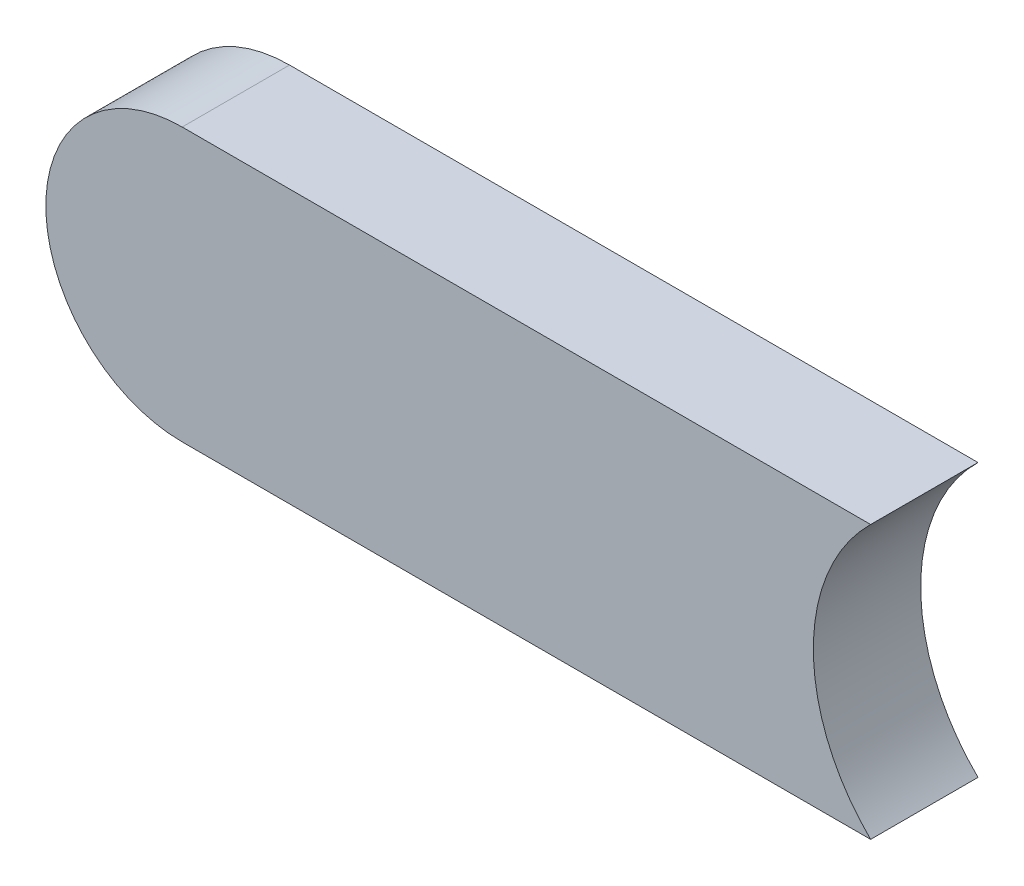
ISO-10303-21;
HEADER;
FILE_DESCRIPTION(('STEP AP214'),'2;1');
FILE_NAME('part.step','',(''),(''),'','','');
FILE_SCHEMA(('AUTOMOTIVE_DESIGN { 1 0 10303 214 1 1 1 1 }'));
ENDSEC;
DATA;
#1=APPLICATION_CONTEXT('core data for automotive mechanical design processes');
#2=APPLICATION_PROTOCOL_DEFINITION('international standard','automotive_design',2000,#1);
#3=PRODUCT_CONTEXT('',#1,'mechanical');
#4=PRODUCT('Part','Part','',(#3));
#5=PRODUCT_RELATED_PRODUCT_CATEGORY('part','',(#4));
#6=PRODUCT_DEFINITION_FORMATION('','',#4);
#7=PRODUCT_DEFINITION_CONTEXT('part definition',#1,'design');
#8=PRODUCT_DEFINITION('design','',#6,#7);
#9=PRODUCT_DEFINITION_SHAPE('','',#8);
#10=(LENGTH_UNIT() NAMED_UNIT(*) SI_UNIT(.MILLI.,.METRE.));
#11=(NAMED_UNIT(*) PLANE_ANGLE_UNIT() SI_UNIT($,.RADIAN.));
#12=(NAMED_UNIT(*) SI_UNIT($,.STERADIAN.) SOLID_ANGLE_UNIT());
#13=UNCERTAINTY_MEASURE_WITH_UNIT(LENGTH_MEASURE(1.E-05),#10,'distance_accuracy_value','');
#14=(GEOMETRIC_REPRESENTATION_CONTEXT(3) GLOBAL_UNCERTAINTY_ASSIGNED_CONTEXT((#13)) GLOBAL_UNIT_ASSIGNED_CONTEXT((#10,
#11,#12)) REPRESENTATION_CONTEXT('',''));
#15=CARTESIAN_POINT('',(0.,0.,0.));
#16=DIRECTION('',(0.,0.,1.));
#17=DIRECTION('',(1.,0.,0.));
#18=AXIS2_PLACEMENT_3D('',#15,#16,#17);
#19=CARTESIAN_POINT('',(132.5807356,99.441,0.));
#20=DIRECTION('',(0.,1.,0.));
#21=DIRECTION('',(1.,0.,0.));
#22=AXIS2_PLACEMENT_3D('',#19,#20,#21);
#23=PLANE('',#22);
#24=DIRECTION('',(1.,0.,0.));
#25=VECTOR('',#24,1.);
#26=CARTESIAN_POINT('',(132.5807356,99.441,0.1999996));
#27=LINE('',#26,#25);
#28=CARTESIAN_POINT('',(132.5807356,99.441,0.1999996));
#29=VERTEX_POINT('',#28);
#30=CARTESIAN_POINT('',(133.863131842133,99.441,0.1999996));
#31=VERTEX_POINT('',#30);
#32=EDGE_CURVE('E11',#29,#31,#27,.T.);
#33=ORIENTED_EDGE('',*,*,#32,.F.);
#34=DIRECTION('',(0.,0.,1.));
#35=VECTOR('',#34,1.);
#36=CARTESIAN_POINT('',(132.5807356,99.441,0.));
#37=LINE('',#36,#35);
#38=CARTESIAN_POINT('',(132.5807356,99.441,0.));
#39=VERTEX_POINT('',#38);
#40=EDGE_CURVE('E24',#39,#29,#37,.T.);
#41=ORIENTED_EDGE('',*,*,#40,.F.);
#42=DIRECTION('',(1.,0.,0.));
#43=VECTOR('',#42,1.);
#44=CARTESIAN_POINT('',(132.5807356,99.441,0.));
#45=LINE('',#44,#43);
#46=CARTESIAN_POINT('',(133.863131842133,99.441,0.));
#47=VERTEX_POINT('',#46);
#48=EDGE_CURVE('E75',#39,#47,#45,.T.);
#49=ORIENTED_EDGE('',*,*,#48,.T.);
#50=DIRECTION('',(0.,0.,1.));
#51=VECTOR('',#50,1.);
#52=CARTESIAN_POINT('',(133.863131842133,99.441,0.));
#53=LINE('',#52,#51);
#54=EDGE_CURVE('E37',#47,#31,#53,.T.);
#55=ORIENTED_EDGE('',*,*,#54,.T.);
#56=EDGE_LOOP('',(#33,#41,#49,#55));
#57=FACE_BOUND('',#56,.T.);
#58=ADVANCED_FACE('F17',(#57),#23,.F.);
#59=CARTESIAN_POINT('',(134.112,99.695,0.));
#60=DIRECTION('',(0.,0.,-1.));
#61=DIRECTION('',(1.,0.,0.));
#62=AXIS2_PLACEMENT_3D('',#59,#60,#61);
#63=CYLINDRICAL_SURFACE('',#62,0.3556);
#64=DIRECTION('',(0.,0.,1.));
#65=VECTOR('',#64,1.);
#66=CARTESIAN_POINT('',(133.863131842133,99.949,0.));
#67=LINE('',#66,#65);
#68=CARTESIAN_POINT('',(133.863131842133,99.949,0.));
#69=VERTEX_POINT('',#68);
#70=CARTESIAN_POINT('',(133.863131842133,99.949,0.1999996));
#71=VERTEX_POINT('',#70);
#72=EDGE_CURVE('E67',#69,#71,#67,.T.);
#73=ORIENTED_EDGE('',*,*,#72,.T.);
#74=CARTESIAN_POINT('',(134.112,99.695,0.1999996));
#75=DIRECTION('',(0.,0.,1.));
#76=DIRECTION('',(1.,0.,0.));
#77=AXIS2_PLACEMENT_3D('',#74,#75,#76);
#78=CIRCLE('',#77,0.3556);
#79=EDGE_CURVE('E82',#71,#31,#78,.T.);
#80=ORIENTED_EDGE('',*,*,#79,.T.);
#81=ORIENTED_EDGE('',*,*,#54,.F.);
#82=CARTESIAN_POINT('',(134.112,99.695,0.));
#83=DIRECTION('',(0.,0.,1.));
#84=DIRECTION('',(1.,0.,0.));
#85=AXIS2_PLACEMENT_3D('',#82,#83,#84);
#86=CIRCLE('',#85,0.3556);
#87=EDGE_CURVE('E80',#69,#47,#86,.T.);
#88=ORIENTED_EDGE('',*,*,#87,.F.);
#89=EDGE_LOOP('',(#73,#80,#81,#88));
#90=FACE_BOUND('',#89,.T.);
#91=ADVANCED_FACE('F88',(#90),#63,.F.);
#92=CARTESIAN_POINT('',(133.863131842133,99.949,0.));
#93=DIRECTION('',(0.,-1.,0.));
#94=DIRECTION('',(-1.,0.,0.));
#95=AXIS2_PLACEMENT_3D('',#92,#93,#94);
#96=PLANE('',#95);
#97=DIRECTION('',(-1.,0.,0.));
#98=VECTOR('',#97,1.);
#99=CARTESIAN_POINT('',(134.112,99.949,0.1999996));
#100=LINE('',#99,#98);
#101=CARTESIAN_POINT('',(132.5807356,99.949,0.1999996));
#102=VERTEX_POINT('',#101);
#103=EDGE_CURVE('E71',#71,#102,#100,.T.);
#104=ORIENTED_EDGE('',*,*,#103,.F.);
#105=ORIENTED_EDGE('',*,*,#72,.F.);
#106=DIRECTION('',(-1.,0.,0.));
#107=VECTOR('',#106,1.);
#108=CARTESIAN_POINT('',(134.112,99.949,0.));
#109=LINE('',#108,#107);
#110=CARTESIAN_POINT('',(132.5807356,99.949,0.));
#111=VERTEX_POINT('',#110);
#112=EDGE_CURVE('E63',#69,#111,#109,.T.);
#113=ORIENTED_EDGE('',*,*,#112,.T.);
#114=DIRECTION('',(0.,0.,1.));
#115=VECTOR('',#114,1.);
#116=CARTESIAN_POINT('',(132.5807356,99.949,0.));
#117=LINE('',#116,#115);
#118=EDGE_CURVE('E53',#111,#102,#117,.T.);
#119=ORIENTED_EDGE('',*,*,#118,.T.);
#120=EDGE_LOOP('',(#104,#105,#113,#119));
#121=FACE_BOUND('',#120,.T.);
#122=ADVANCED_FACE('F66',(#121),#96,.F.);
#123=CARTESIAN_POINT('',(132.5807356,99.695,0.));
#124=DIRECTION('',(0.,0.,-1.));
#125=DIRECTION('',(1.11896493820492E-13,1.,0.));
#126=AXIS2_PLACEMENT_3D('',#123,#124,#125);
#127=CYLINDRICAL_SURFACE('',#126,0.253999999999995);
#128=CARTESIAN_POINT('',(132.5807356,99.695,0.1999996));
#129=DIRECTION('',(0.,0.,1.));
#130=DIRECTION('',(1.11896493820492E-13,1.,0.));
#131=AXIS2_PLACEMENT_3D('',#128,#129,#130);
#132=CIRCLE('',#131,0.253999999999995);
#133=EDGE_CURVE('E59',#102,#29,#132,.T.);
#134=ORIENTED_EDGE('',*,*,#133,.F.);
#135=ORIENTED_EDGE('',*,*,#118,.F.);
#136=CARTESIAN_POINT('',(132.5807356,99.695,0.));
#137=DIRECTION('',(0.,0.,1.));
#138=DIRECTION('',(1.11896493820492E-13,1.,0.));
#139=AXIS2_PLACEMENT_3D('',#136,#137,#138);
#140=CIRCLE('',#139,0.253999999999995);
#141=EDGE_CURVE('E57',#111,#39,#140,.T.);
#142=ORIENTED_EDGE('',*,*,#141,.T.);
#143=ORIENTED_EDGE('',*,*,#40,.T.);
#144=EDGE_LOOP('',(#134,#135,#142,#143));
#145=FACE_BOUND('',#144,.T.);
#146=ADVANCED_FACE('F55',(#145),#127,.T.);
#147=CARTESIAN_POINT('',(132.5807356,99.441,0.));
#148=DIRECTION('',(0.,0.,-1.));
#149=DIRECTION('',(-1.,0.,0.));
#150=AXIS2_PLACEMENT_3D('',#147,#148,#149);
#151=PLANE('',#150);
#152=ORIENTED_EDGE('',*,*,#48,.F.);
#153=ORIENTED_EDGE('',*,*,#141,.F.);
#154=ORIENTED_EDGE('',*,*,#112,.F.);
#155=ORIENTED_EDGE('',*,*,#87,.T.);
#156=EDGE_LOOP('',(#152,#153,#154,#155));
#157=FACE_BOUND('',#156,.T.);
#158=ADVANCED_FACE('F74',(#157),#151,.T.);
#159=CARTESIAN_POINT('',(132.5807356,99.441,0.1999996));
#160=DIRECTION('',(0.,0.,-1.));
#161=DIRECTION('',(-1.,0.,0.));
#162=AXIS2_PLACEMENT_3D('',#159,#160,#161);
#163=PLANE('',#162);
#164=ORIENTED_EDGE('',*,*,#133,.T.);
#165=ORIENTED_EDGE('',*,*,#32,.T.);
#166=ORIENTED_EDGE('',*,*,#79,.F.);
#167=ORIENTED_EDGE('',*,*,#103,.T.);
#168=EDGE_LOOP('',(#164,#165,#166,#167));
#169=FACE_BOUND('',#168,.T.);
#170=ADVANCED_FACE('F91',(#169),#163,.F.);
#171=CLOSED_SHELL('',(#58,#91,#122,#146,#158,#170));
#172=MANIFOLD_SOLID_BREP('B1',#171);
#173=ADVANCED_BREP_SHAPE_REPRESENTATION('',(#18,#172),#14);
#174=SHAPE_DEFINITION_REPRESENTATION(#9,#173);
ENDSEC;
END-ISO-10303-21;
